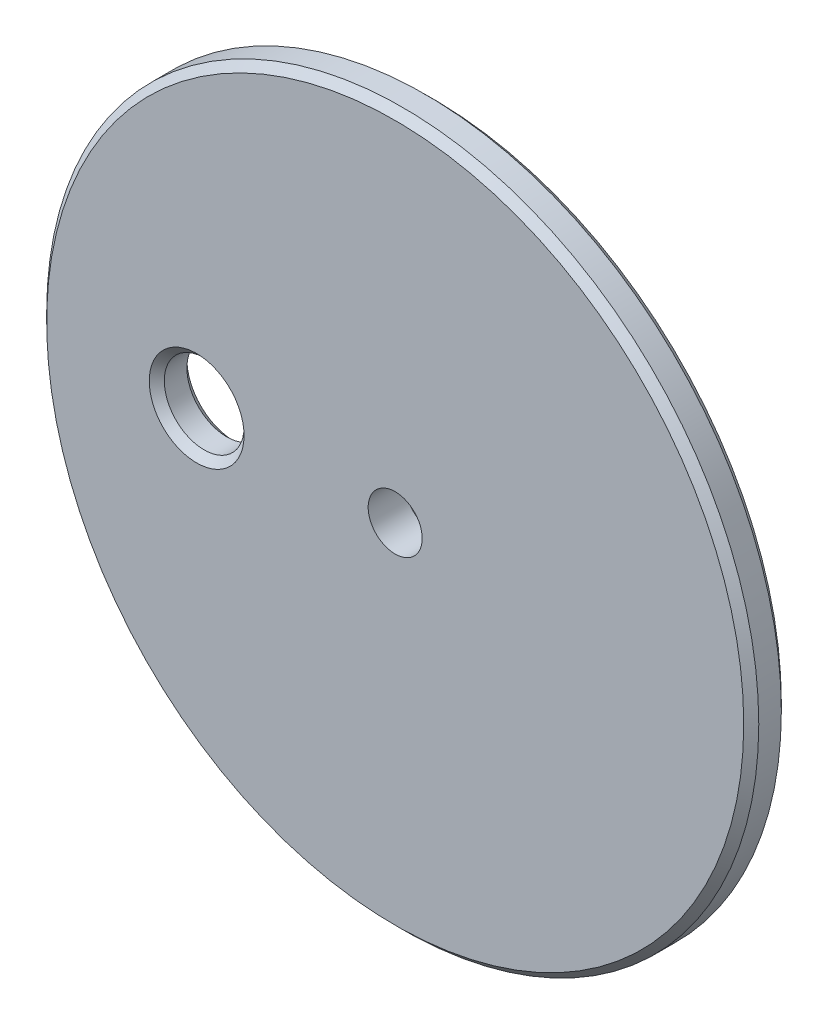
ISO-10303-21;
HEADER;
FILE_DESCRIPTION(('STEP AP214'),'2;1');
FILE_NAME('part.step','',(''),(''),'','','');
FILE_SCHEMA(('AUTOMOTIVE_DESIGN { 1 0 10303 214 1 1 1 1 }'));
ENDSEC;
DATA;
#1=APPLICATION_CONTEXT('core data for automotive mechanical design processes');
#2=APPLICATION_PROTOCOL_DEFINITION('international standard','automotive_design',2000,#1);
#3=PRODUCT_CONTEXT('',#1,'mechanical');
#4=PRODUCT('Part','Part','',(#3));
#5=PRODUCT_RELATED_PRODUCT_CATEGORY('part','',(#4));
#6=PRODUCT_DEFINITION_FORMATION('','',#4);
#7=PRODUCT_DEFINITION_CONTEXT('part definition',#1,'design');
#8=PRODUCT_DEFINITION('design','',#6,#7);
#9=PRODUCT_DEFINITION_SHAPE('','',#8);
#10=(LENGTH_UNIT() NAMED_UNIT(*) SI_UNIT(.MILLI.,.METRE.));
#11=(NAMED_UNIT(*) PLANE_ANGLE_UNIT() SI_UNIT($,.RADIAN.));
#12=(NAMED_UNIT(*) SI_UNIT($,.STERADIAN.) SOLID_ANGLE_UNIT());
#13=UNCERTAINTY_MEASURE_WITH_UNIT(LENGTH_MEASURE(1.E-05),#10,'distance_accuracy_value','');
#14=(GEOMETRIC_REPRESENTATION_CONTEXT(3) GLOBAL_UNCERTAINTY_ASSIGNED_CONTEXT((#13)) GLOBAL_UNIT_ASSIGNED_CONTEXT((#10,
#11,#12)) REPRESENTATION_CONTEXT('',''));
#15=CARTESIAN_POINT('',(0.,0.,0.));
#16=DIRECTION('',(0.,0.,1.));
#17=DIRECTION('',(1.,0.,0.));
#18=AXIS2_PLACEMENT_3D('',#15,#16,#17);
#19=CARTESIAN_POINT('',(0.,0.,5.));
#20=DIRECTION('',(0.,0.,1.));
#21=DIRECTION('',(1.,0.,0.));
#22=AXIS2_PLACEMENT_3D('',#19,#20,#21);
#23=PLANE('',#22);
#24=CARTESIAN_POINT('',(0.,0.,5.));
#25=DIRECTION('',(0.,0.,1.));
#26=DIRECTION('',(1.,0.,0.));
#27=AXIS2_PLACEMENT_3D('',#24,#25,#26);
#28=CIRCLE('',#27,46.3359124960528);
#29=CARTESIAN_POINT('',(46.3359124960528,0.,5.));
#30=VERTEX_POINT('',#29);
#31=EDGE_CURVE('E52',#30,#30,#28,.T.);
#32=ORIENTED_EDGE('',*,*,#31,.T.);
#33=EDGE_LOOP('',(#32));
#34=FACE_BOUND('',#33,.T.);
#35=CARTESIAN_POINT('',(-26.3942954682143,0.,5.));
#36=DIRECTION('',(0.,0.,1.));
#37=DIRECTION('',(1.,0.,0.));
#38=AXIS2_PLACEMENT_3D('',#35,#36,#37);
#39=CIRCLE('',#38,6.3022799711418);
#40=CARTESIAN_POINT('',(-20.0920154970725,0.,5.));
#41=VERTEX_POINT('',#40);
#42=EDGE_CURVE('E56',#41,#41,#39,.F.);
#43=ORIENTED_EDGE('',*,*,#42,.T.);
#44=EDGE_LOOP('',(#43));
#45=FACE_BOUND('',#44,.T.);
#46=CARTESIAN_POINT('',(0.,0.,5.));
#47=DIRECTION('',(0.,0.,1.));
#48=DIRECTION('',(1.,0.,0.));
#49=AXIS2_PLACEMENT_3D('',#46,#47,#48);
#50=CIRCLE('',#49,3.59201549707255);
#51=CARTESIAN_POINT('',(3.59201549707255,0.,5.));
#52=VERTEX_POINT('',#51);
#53=EDGE_CURVE('E73',#52,#52,#50,.T.);
#54=ORIENTED_EDGE('',*,*,#53,.F.);
#55=EDGE_LOOP('',(#54));
#56=FACE_BOUND('',#55,.T.);
#57=ADVANCED_FACE('F40',(#34,#45,#56),#23,.T.);
#58=CARTESIAN_POINT('',(0.,0.,0.));
#59=DIRECTION('',(0.,0.,1.));
#60=DIRECTION('',(1.,0.,0.));
#61=AXIS2_PLACEMENT_3D('',#58,#59,#60);
#62=PLANE('',#61);
#63=CARTESIAN_POINT('',(0.,0.,0.));
#64=DIRECTION('',(0.,0.,1.));
#65=DIRECTION('',(1.,0.,0.));
#66=AXIS2_PLACEMENT_3D('',#63,#64,#65);
#67=CIRCLE('',#66,46.3359124960528);
#68=CARTESIAN_POINT('',(46.3359124960528,0.,0.));
#69=VERTEX_POINT('',#68);
#70=EDGE_CURVE('E61',#69,#69,#67,.F.);
#71=ORIENTED_EDGE('',*,*,#70,.T.);
#72=EDGE_LOOP('',(#71));
#73=FACE_BOUND('',#72,.T.);
#74=CARTESIAN_POINT('',(-26.3942954682143,0.,0.));
#75=DIRECTION('',(0.,0.,1.));
#76=DIRECTION('',(1.,0.,0.));
#77=AXIS2_PLACEMENT_3D('',#74,#75,#76);
#78=CIRCLE('',#77,6.30227997114177);
#79=CARTESIAN_POINT('',(-20.0920154970725,0.,0.));
#80=VERTEX_POINT('',#79);
#81=EDGE_CURVE('E64',#80,#80,#78,.T.);
#82=ORIENTED_EDGE('',*,*,#81,.T.);
#83=EDGE_LOOP('',(#82));
#84=FACE_BOUND('',#83,.T.);
#85=CARTESIAN_POINT('',(0.,0.,0.));
#86=DIRECTION('',(0.,0.,1.));
#87=DIRECTION('',(1.,0.,0.));
#88=AXIS2_PLACEMENT_3D('',#85,#86,#87);
#89=CIRCLE('',#88,3.59201549707255);
#90=CARTESIAN_POINT('',(3.59201549707255,0.,0.));
#91=VERTEX_POINT('',#90);
#92=EDGE_CURVE('E74',#91,#91,#89,.T.);
#93=ORIENTED_EDGE('',*,*,#92,.T.);
#94=EDGE_LOOP('',(#93));
#95=FACE_BOUND('',#94,.T.);
#96=ADVANCED_FACE('F84',(#73,#84,#95),#62,.F.);
#97=CARTESIAN_POINT('',(0.,0.,5.));
#98=DIRECTION('',(0.,0.,-1.));
#99=DIRECTION('',(-1.,0.,0.));
#100=AXIS2_PLACEMENT_3D('',#97,#98,#99);
#101=CYLINDRICAL_SURFACE('',#100,47.3359124960528);
#102=CARTESIAN_POINT('',(0.,0.,1.00000000000001));
#103=DIRECTION('',(0.,0.,1.));
#104=DIRECTION('',(1.,0.,0.));
#105=AXIS2_PLACEMENT_3D('',#102,#103,#104);
#106=CIRCLE('',#105,47.3359124960528);
#107=CARTESIAN_POINT('',(47.3359124960528,0.,1.00000000000001));
#108=VERTEX_POINT('',#107);
#109=EDGE_CURVE('E67',#108,#108,#106,.T.);
#110=ORIENTED_EDGE('',*,*,#109,.T.);
#111=EDGE_LOOP('',(#110));
#112=FACE_BOUND('',#111,.T.);
#113=CARTESIAN_POINT('',(0.,0.,3.99999999999998));
#114=DIRECTION('',(0.,0.,1.));
#115=DIRECTION('',(1.,0.,0.));
#116=AXIS2_PLACEMENT_3D('',#113,#114,#115);
#117=CIRCLE('',#116,47.3359124960528);
#118=CARTESIAN_POINT('',(47.3359124960528,0.,3.99999999999998));
#119=VERTEX_POINT('',#118);
#120=EDGE_CURVE('E70',#119,#119,#117,.F.);
#121=ORIENTED_EDGE('',*,*,#120,.T.);
#122=EDGE_LOOP('',(#121));
#123=FACE_BOUND('',#122,.T.);
#124=ADVANCED_FACE('F90',(#112,#123),#101,.T.);
#125=CARTESIAN_POINT('',(0.,0.,5.));
#126=DIRECTION('',(0.,0.,-1.));
#127=DIRECTION('',(-1.,0.,0.));
#128=AXIS2_PLACEMENT_3D('',#125,#126,#127);
#129=CYLINDRICAL_SURFACE('',#128,3.59201549707255);
#130=ORIENTED_EDGE('',*,*,#53,.T.);
#131=EDGE_LOOP('',(#130));
#132=FACE_BOUND('',#131,.T.);
#133=ORIENTED_EDGE('',*,*,#92,.F.);
#134=EDGE_LOOP('',(#133));
#135=FACE_BOUND('',#134,.T.);
#136=ADVANCED_FACE('F80',(#132,#135),#129,.F.);
#137=CARTESIAN_POINT('',(-26.3942954682143,0.,5.));
#138=DIRECTION('',(0.,0.,-1.));
#139=DIRECTION('',(-1.,0.,0.));
#140=AXIS2_PLACEMENT_3D('',#137,#138,#139);
#141=CYLINDRICAL_SURFACE('',#140,5.30227997114176);
#142=CARTESIAN_POINT('',(-26.3942954682143,0.,1.00000000000002));
#143=DIRECTION('',(0.,0.,1.));
#144=DIRECTION('',(1.,0.,0.));
#145=AXIS2_PLACEMENT_3D('',#142,#143,#144);
#146=CIRCLE('',#145,5.30227997114176);
#147=CARTESIAN_POINT('',(-21.0920154970725,0.,1.00000000000002));
#148=VERTEX_POINT('',#147);
#149=EDGE_CURVE('E10',#148,#148,#146,.F.);
#150=ORIENTED_EDGE('',*,*,#149,.T.);
#151=EDGE_LOOP('',(#150));
#152=FACE_BOUND('',#151,.T.);
#153=CARTESIAN_POINT('',(-26.3942954682143,0.,3.99999999999997));
#154=DIRECTION('',(0.,0.,1.));
#155=DIRECTION('',(1.,0.,0.));
#156=AXIS2_PLACEMENT_3D('',#153,#154,#155);
#157=CIRCLE('',#156,5.30227997114176);
#158=CARTESIAN_POINT('',(-21.0920154970725,0.,3.99999999999997));
#159=VERTEX_POINT('',#158);
#160=EDGE_CURVE('E48',#159,#159,#157,.T.);
#161=ORIENTED_EDGE('',*,*,#160,.T.);
#162=EDGE_LOOP('',(#161));
#163=FACE_BOUND('',#162,.T.);
#164=ADVANCED_FACE('F108',(#152,#163),#141,.F.);
#165=CARTESIAN_POINT('',(0.,0.,1.00000000000001));
#166=DIRECTION('',(0.,0.,1.));
#167=DIRECTION('',(1.,0.,0.));
#168=AXIS2_PLACEMENT_3D('',#165,#166,#167);
#169=CONICAL_SURFACE('',#168,47.3359124960528,0.785398163397445);
#170=ORIENTED_EDGE('',*,*,#70,.F.);
#171=EDGE_LOOP('',(#170));
#172=FACE_BOUND('',#171,.T.);
#173=ORIENTED_EDGE('',*,*,#109,.F.);
#174=EDGE_LOOP('',(#173));
#175=FACE_BOUND('',#174,.T.);
#176=ADVANCED_FACE('F101',(#172,#175),#169,.T.);
#177=CARTESIAN_POINT('',(0.,0.,5.));
#178=DIRECTION('',(0.,0.,-1.));
#179=DIRECTION('',(-1.,0.,0.));
#180=AXIS2_PLACEMENT_3D('',#177,#178,#179);
#181=CONICAL_SURFACE('',#180,46.3359124960528,0.785398163397438);
#182=ORIENTED_EDGE('',*,*,#120,.F.);
#183=EDGE_LOOP('',(#182));
#184=FACE_BOUND('',#183,.T.);
#185=ORIENTED_EDGE('',*,*,#31,.F.);
#186=EDGE_LOOP('',(#185));
#187=FACE_BOUND('',#186,.T.);
#188=ADVANCED_FACE('F107',(#184,#187),#181,.T.);
#189=CARTESIAN_POINT('',(-26.3942954682143,0.,0.));
#190=DIRECTION('',(0.,0.,-1.));
#191=DIRECTION('',(-1.,0.,0.));
#192=AXIS2_PLACEMENT_3D('',#189,#190,#191);
#193=CONICAL_SURFACE('',#192,6.30227997114177,0.785398163397441);
#194=ORIENTED_EDGE('',*,*,#149,.F.);
#195=EDGE_LOOP('',(#194));
#196=FACE_BOUND('',#195,.T.);
#197=ORIENTED_EDGE('',*,*,#81,.F.);
#198=EDGE_LOOP('',(#197));
#199=FACE_BOUND('',#198,.T.);
#200=ADVANCED_FACE('F114',(#196,#199),#193,.F.);
#201=CARTESIAN_POINT('',(-26.3942954682143,0.,3.99999999999997));
#202=DIRECTION('',(0.,0.,1.));
#203=DIRECTION('',(1.,0.,0.));
#204=AXIS2_PLACEMENT_3D('',#201,#202,#203);
#205=CONICAL_SURFACE('',#204,5.30227997114176,0.785398163397453);
#206=ORIENTED_EDGE('',*,*,#42,.F.);
#207=EDGE_LOOP('',(#206));
#208=FACE_BOUND('',#207,.T.);
#209=ORIENTED_EDGE('',*,*,#160,.F.);
#210=EDGE_LOOP('',(#209));
#211=FACE_BOUND('',#210,.T.);
#212=ADVANCED_FACE('F43',(#208,#211),#205,.F.);
#213=CLOSED_SHELL('',(#57,#96,#124,#136,#164,#176,#188,#200,#212));
#214=MANIFOLD_SOLID_BREP('B2',#213);
#215=ADVANCED_BREP_SHAPE_REPRESENTATION('',(#18,#214),#14);
#216=SHAPE_DEFINITION_REPRESENTATION(#9,#215);
ENDSEC;
END-ISO-10303-21;
